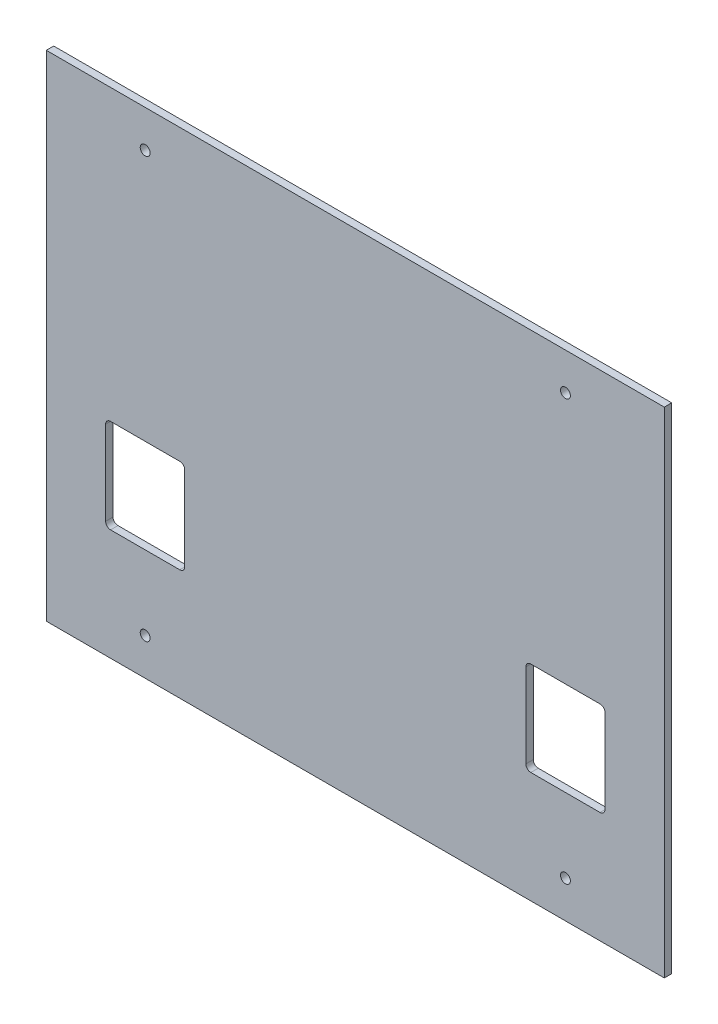
ISO-10303-21;
HEADER;
FILE_DESCRIPTION(('STEP AP214'),'2;1');
FILE_NAME('part.step','',(''),(''),'','','');
FILE_SCHEMA(('AUTOMOTIVE_DESIGN { 1 0 10303 214 1 1 1 1 }'));
ENDSEC;
DATA;
#1=APPLICATION_CONTEXT('core data for automotive mechanical design processes');
#2=APPLICATION_PROTOCOL_DEFINITION('international standard','automotive_design',2000,#1);
#3=PRODUCT_CONTEXT('',#1,'mechanical');
#4=PRODUCT('Part','Part','',(#3));
#5=PRODUCT_RELATED_PRODUCT_CATEGORY('part','',(#4));
#6=PRODUCT_DEFINITION_FORMATION('','',#4);
#7=PRODUCT_DEFINITION_CONTEXT('part definition',#1,'design');
#8=PRODUCT_DEFINITION('design','',#6,#7);
#9=PRODUCT_DEFINITION_SHAPE('','',#8);
#10=(LENGTH_UNIT() NAMED_UNIT(*) SI_UNIT(.MILLI.,.METRE.));
#11=(NAMED_UNIT(*) PLANE_ANGLE_UNIT() SI_UNIT($,.RADIAN.));
#12=(NAMED_UNIT(*) SI_UNIT($,.STERADIAN.) SOLID_ANGLE_UNIT());
#13=UNCERTAINTY_MEASURE_WITH_UNIT(LENGTH_MEASURE(1.E-05),#10,'distance_accuracy_value','');
#14=(GEOMETRIC_REPRESENTATION_CONTEXT(3) GLOBAL_UNCERTAINTY_ASSIGNED_CONTEXT((#13)) GLOBAL_UNIT_ASSIGNED_CONTEXT((#10,
#11,#12)) REPRESENTATION_CONTEXT('',''));
#15=CARTESIAN_POINT('',(0.,0.,0.));
#16=DIRECTION('',(0.,0.,1.));
#17=DIRECTION('',(1.,0.,0.));
#18=AXIS2_PLACEMENT_3D('',#15,#16,#17);
#19=CARTESIAN_POINT('',(-125.,-100.,3.));
#20=DIRECTION('',(1.,0.,0.));
#21=DIRECTION('',(0.,1.,0.));
#22=AXIS2_PLACEMENT_3D('',#19,#20,#21);
#23=PLANE('',#22);
#24=DIRECTION('',(0.,-1.,0.));
#25=VECTOR('',#24,1.);
#26=CARTESIAN_POINT('',(-125.,-100.,0.));
#27=LINE('',#26,#25);
#28=CARTESIAN_POINT('',(-125.,100.,0.));
#29=VERTEX_POINT('',#28);
#30=CARTESIAN_POINT('',(-125.,-100.,0.));
#31=VERTEX_POINT('',#30);
#32=EDGE_CURVE('E314',#29,#31,#27,.T.);
#33=ORIENTED_EDGE('',*,*,#32,.T.);
#34=DIRECTION('',(0.,0.,-1.));
#35=VECTOR('',#34,1.);
#36=CARTESIAN_POINT('',(-125.,-100.,3.));
#37=LINE('',#36,#35);
#38=CARTESIAN_POINT('',(-125.,-100.,3.));
#39=VERTEX_POINT('',#38);
#40=EDGE_CURVE('E11',#39,#31,#37,.T.);
#41=ORIENTED_EDGE('',*,*,#40,.F.);
#42=DIRECTION('',(0.,-1.,0.));
#43=VECTOR('',#42,1.);
#44=CARTESIAN_POINT('',(-125.,-100.,3.));
#45=LINE('',#44,#43);
#46=CARTESIAN_POINT('',(-125.,100.,3.));
#47=VERTEX_POINT('',#46);
#48=EDGE_CURVE('E317',#47,#39,#45,.T.);
#49=ORIENTED_EDGE('',*,*,#48,.F.);
#50=DIRECTION('',(0.,0.,-1.));
#51=VECTOR('',#50,1.);
#52=CARTESIAN_POINT('',(-125.,100.,3.));
#53=LINE('',#52,#51);
#54=EDGE_CURVE('E327',#47,#29,#53,.T.);
#55=ORIENTED_EDGE('',*,*,#54,.T.);
#56=EDGE_LOOP('',(#33,#41,#49,#55));
#57=FACE_BOUND('',#56,.T.);
#58=ADVANCED_FACE('F35',(#57),#23,.F.);
#59=CARTESIAN_POINT('',(125.,-100.,3.));
#60=DIRECTION('',(0.,1.,0.));
#61=DIRECTION('',(-1.,0.,0.));
#62=AXIS2_PLACEMENT_3D('',#59,#60,#61);
#63=PLANE('',#62);
#64=DIRECTION('',(1.,0.,0.));
#65=VECTOR('',#64,1.);
#66=CARTESIAN_POINT('',(125.,-100.,0.));
#67=LINE('',#66,#65);
#68=CARTESIAN_POINT('',(125.,-100.,0.));
#69=VERTEX_POINT('',#68);
#70=EDGE_CURVE('E330',#31,#69,#67,.T.);
#71=ORIENTED_EDGE('',*,*,#70,.T.);
#72=DIRECTION('',(0.,0.,-1.));
#73=VECTOR('',#72,1.);
#74=CARTESIAN_POINT('',(125.,-100.,3.));
#75=LINE('',#74,#73);
#76=CARTESIAN_POINT('',(125.,-100.,3.));
#77=VERTEX_POINT('',#76);
#78=EDGE_CURVE('E42',#77,#69,#75,.T.);
#79=ORIENTED_EDGE('',*,*,#78,.F.);
#80=DIRECTION('',(1.,0.,0.));
#81=VECTOR('',#80,1.);
#82=CARTESIAN_POINT('',(125.,-100.,3.));
#83=LINE('',#82,#81);
#84=EDGE_CURVE('E320',#39,#77,#83,.T.);
#85=ORIENTED_EDGE('',*,*,#84,.F.);
#86=ORIENTED_EDGE('',*,*,#40,.T.);
#87=EDGE_LOOP('',(#71,#79,#85,#86));
#88=FACE_BOUND('',#87,.T.);
#89=ADVANCED_FACE('F359',(#88),#63,.F.);
#90=CARTESIAN_POINT('',(125.,-100.,3.));
#91=DIRECTION('',(-1.,0.,0.));
#92=DIRECTION('',(0.,0.,1.));
#93=AXIS2_PLACEMENT_3D('',#90,#91,#92);
#94=PLANE('',#93);
#95=DIRECTION('',(0.,1.,0.));
#96=VECTOR('',#95,1.);
#97=CARTESIAN_POINT('',(125.,-100.,0.));
#98=LINE('',#97,#96);
#99=CARTESIAN_POINT('',(125.,100.,0.));
#100=VERTEX_POINT('',#99);
#101=EDGE_CURVE('E332',#69,#100,#98,.T.);
#102=ORIENTED_EDGE('',*,*,#101,.T.);
#103=DIRECTION('',(0.,0.,-1.));
#104=VECTOR('',#103,1.);
#105=CARTESIAN_POINT('',(125.,100.,3.));
#106=LINE('',#105,#104);
#107=CARTESIAN_POINT('',(125.,100.,3.));
#108=VERTEX_POINT('',#107);
#109=EDGE_CURVE('E337',#108,#100,#106,.T.);
#110=ORIENTED_EDGE('',*,*,#109,.F.);
#111=DIRECTION('',(0.,1.,0.));
#112=VECTOR('',#111,1.);
#113=CARTESIAN_POINT('',(125.,-100.,3.));
#114=LINE('',#113,#112);
#115=EDGE_CURVE('E323',#77,#108,#114,.T.);
#116=ORIENTED_EDGE('',*,*,#115,.F.);
#117=ORIENTED_EDGE('',*,*,#78,.T.);
#118=EDGE_LOOP('',(#102,#110,#116,#117));
#119=FACE_BOUND('',#118,.T.);
#120=ADVANCED_FACE('F344',(#119),#94,.F.);
#121=CARTESIAN_POINT('',(125.,100.,3.));
#122=DIRECTION('',(0.,-1.,0.));
#123=DIRECTION('',(0.,0.,-1.));
#124=AXIS2_PLACEMENT_3D('',#121,#122,#123);
#125=PLANE('',#124);
#126=DIRECTION('',(-1.,0.,0.));
#127=VECTOR('',#126,1.);
#128=CARTESIAN_POINT('',(125.,100.,0.));
#129=LINE('',#128,#127);
#130=EDGE_CURVE('E321',#100,#29,#129,.T.);
#131=ORIENTED_EDGE('',*,*,#130,.T.);
#132=ORIENTED_EDGE('',*,*,#54,.F.);
#133=DIRECTION('',(-1.,0.,0.));
#134=VECTOR('',#133,1.);
#135=CARTESIAN_POINT('',(125.,100.,3.));
#136=LINE('',#135,#134);
#137=EDGE_CURVE('E325',#108,#47,#136,.T.);
#138=ORIENTED_EDGE('',*,*,#137,.F.);
#139=ORIENTED_EDGE('',*,*,#109,.T.);
#140=EDGE_LOOP('',(#131,#132,#138,#139));
#141=FACE_BOUND('',#140,.T.);
#142=ADVANCED_FACE('F352',(#141),#125,.F.);
#143=CARTESIAN_POINT('',(0.,0.,3.));
#144=DIRECTION('',(0.,0.,1.));
#145=DIRECTION('',(1.,0.,0.));
#146=AXIS2_PLACEMENT_3D('',#143,#144,#145);
#147=PLANE('',#146);
#148=CARTESIAN_POINT('',(98.9999999999928,-53.0000000000045,3.));
#149=DIRECTION('',(0.,0.,1.));
#150=DIRECTION('',(1.,0.,0.));
#151=AXIS2_PLACEMENT_3D('',#148,#149,#150);
#152=CIRCLE('',#151,2.);
#153=CARTESIAN_POINT('',(98.9999999999928,-55.0000000000045,3.));
#154=VERTEX_POINT('',#153);
#155=CARTESIAN_POINT('',(100.999999999993,-53.0000000000045,3.));
#156=VERTEX_POINT('',#155);
#157=EDGE_CURVE('E290',#154,#156,#152,.T.);
#158=ORIENTED_EDGE('',*,*,#157,.F.);
#159=DIRECTION('',(1.,0.,0.));
#160=VECTOR('',#159,1.);
#161=CARTESIAN_POINT('',(0.,-55.0000000000045,3.));
#162=LINE('',#161,#160);
#163=CARTESIAN_POINT('',(70.9999999999929,-55.0000000000045,3.));
#164=VERTEX_POINT('',#163);
#165=EDGE_CURVE('E277',#164,#154,#162,.T.);
#166=ORIENTED_EDGE('',*,*,#165,.F.);
#167=CARTESIAN_POINT('',(70.9999999999929,-53.0000000000045,3.));
#168=DIRECTION('',(0.,0.,1.));
#169=DIRECTION('',(1.,0.,0.));
#170=AXIS2_PLACEMENT_3D('',#167,#168,#169);
#171=CIRCLE('',#170,2.);
#172=CARTESIAN_POINT('',(68.9999999999929,-53.0000000000045,3.));
#173=VERTEX_POINT('',#172);
#174=EDGE_CURVE('E176',#173,#164,#171,.T.);
#175=ORIENTED_EDGE('',*,*,#174,.F.);
#176=DIRECTION('',(0.,-1.,0.));
#177=VECTOR('',#176,1.);
#178=CARTESIAN_POINT('',(68.9999999999929,0.,3.));
#179=LINE('',#178,#177);
#180=CARTESIAN_POINT('',(68.9999999999929,-19.0000000000046,3.));
#181=VERTEX_POINT('',#180);
#182=EDGE_CURVE('E280',#181,#173,#179,.T.);
#183=ORIENTED_EDGE('',*,*,#182,.F.);
#184=CARTESIAN_POINT('',(70.9999999999929,-19.0000000000046,3.));
#185=DIRECTION('',(0.,0.,1.));
#186=DIRECTION('',(1.,0.,0.));
#187=AXIS2_PLACEMENT_3D('',#184,#185,#186);
#188=CIRCLE('',#187,2.);
#189=CARTESIAN_POINT('',(70.9999999999929,-17.0000000000046,3.));
#190=VERTEX_POINT('',#189);
#191=EDGE_CURVE('E282',#190,#181,#188,.T.);
#192=ORIENTED_EDGE('',*,*,#191,.F.);
#193=DIRECTION('',(-1.,0.,0.));
#194=VECTOR('',#193,1.);
#195=CARTESIAN_POINT('',(0.,-17.0000000000046,3.));
#196=LINE('',#195,#194);
#197=CARTESIAN_POINT('',(98.9999999999928,-17.0000000000046,3.));
#198=VERTEX_POINT('',#197);
#199=EDGE_CURVE('E284',#198,#190,#196,.T.);
#200=ORIENTED_EDGE('',*,*,#199,.F.);
#201=CARTESIAN_POINT('',(98.9999999999928,-19.0000000000046,3.));
#202=DIRECTION('',(0.,0.,1.));
#203=DIRECTION('',(1.,0.,0.));
#204=AXIS2_PLACEMENT_3D('',#201,#202,#203);
#205=CIRCLE('',#204,2.);
#206=CARTESIAN_POINT('',(100.999999999993,-19.0000000000046,3.));
#207=VERTEX_POINT('',#206);
#208=EDGE_CURVE('E286',#207,#198,#205,.T.);
#209=ORIENTED_EDGE('',*,*,#208,.F.);
#210=DIRECTION('',(0.,1.,0.));
#211=VECTOR('',#210,1.);
#212=CARTESIAN_POINT('',(100.999999999993,0.,3.));
#213=LINE('',#212,#211);
#214=EDGE_CURVE('E288',#156,#207,#213,.T.);
#215=ORIENTED_EDGE('',*,*,#214,.F.);
#216=EDGE_LOOP('',(#158,#166,#175,#183,#192,#200,#209,#215));
#217=FACE_BOUND('',#216,.T.);
#218=CARTESIAN_POINT('',(-98.9999999999928,-19.0000000000046,3.));
#219=DIRECTION('',(0.,0.,1.));
#220=DIRECTION('',(1.,0.,0.));
#221=AXIS2_PLACEMENT_3D('',#218,#219,#220);
#222=CIRCLE('',#221,2.);
#223=CARTESIAN_POINT('',(-98.9999999999928,-17.0000000000046,3.));
#224=VERTEX_POINT('',#223);
#225=CARTESIAN_POINT('',(-100.999999999993,-19.0000000000046,3.));
#226=VERTEX_POINT('',#225);
#227=EDGE_CURVE('E275',#224,#226,#222,.T.);
#228=ORIENTED_EDGE('',*,*,#227,.F.);
#229=DIRECTION('',(-1.,0.,0.));
#230=VECTOR('',#229,1.);
#231=CARTESIAN_POINT('',(0.,-17.0000000000046,3.));
#232=LINE('',#231,#230);
#233=CARTESIAN_POINT('',(-70.9999999999929,-17.0000000000046,3.));
#234=VERTEX_POINT('',#233);
#235=EDGE_CURVE('E213',#234,#224,#232,.T.);
#236=ORIENTED_EDGE('',*,*,#235,.F.);
#237=CARTESIAN_POINT('',(-70.9999999999929,-19.0000000000046,3.));
#238=DIRECTION('',(0.,0.,1.));
#239=DIRECTION('',(1.,0.,0.));
#240=AXIS2_PLACEMENT_3D('',#237,#238,#239);
#241=CIRCLE('',#240,2.);
#242=CARTESIAN_POINT('',(-68.9999999999929,-19.0000000000046,3.));
#243=VERTEX_POINT('',#242);
#244=EDGE_CURVE('E263',#243,#234,#241,.T.);
#245=ORIENTED_EDGE('',*,*,#244,.F.);
#246=DIRECTION('',(0.,1.,0.));
#247=VECTOR('',#246,1.);
#248=CARTESIAN_POINT('',(-68.9999999999929,0.,3.));
#249=LINE('',#248,#247);
#250=CARTESIAN_POINT('',(-68.9999999999929,-53.0000000000045,3.));
#251=VERTEX_POINT('',#250);
#252=EDGE_CURVE('E265',#251,#243,#249,.T.);
#253=ORIENTED_EDGE('',*,*,#252,.F.);
#254=CARTESIAN_POINT('',(-70.9999999999929,-53.0000000000045,3.));
#255=DIRECTION('',(0.,0.,1.));
#256=DIRECTION('',(1.,0.,0.));
#257=AXIS2_PLACEMENT_3D('',#254,#255,#256);
#258=CIRCLE('',#257,2.);
#259=CARTESIAN_POINT('',(-70.9999999999929,-55.0000000000045,3.));
#260=VERTEX_POINT('',#259);
#261=EDGE_CURVE('E267',#260,#251,#258,.T.);
#262=ORIENTED_EDGE('',*,*,#261,.F.);
#263=DIRECTION('',(1.,0.,0.));
#264=VECTOR('',#263,1.);
#265=CARTESIAN_POINT('',(0.,-55.0000000000045,3.));
#266=LINE('',#265,#264);
#267=CARTESIAN_POINT('',(-98.9999999999928,-55.0000000000045,3.));
#268=VERTEX_POINT('',#267);
#269=EDGE_CURVE('E269',#268,#260,#266,.T.);
#270=ORIENTED_EDGE('',*,*,#269,.F.);
#271=CARTESIAN_POINT('',(-98.9999999999928,-53.0000000000045,3.));
#272=DIRECTION('',(0.,0.,1.));
#273=DIRECTION('',(1.,0.,0.));
#274=AXIS2_PLACEMENT_3D('',#271,#272,#273);
#275=CIRCLE('',#274,2.);
#276=CARTESIAN_POINT('',(-100.999999999993,-53.0000000000045,3.));
#277=VERTEX_POINT('',#276);
#278=EDGE_CURVE('E271',#277,#268,#275,.T.);
#279=ORIENTED_EDGE('',*,*,#278,.F.);
#280=DIRECTION('',(0.,-1.,0.));
#281=VECTOR('',#280,1.);
#282=CARTESIAN_POINT('',(-100.999999999993,0.,3.));
#283=LINE('',#282,#281);
#284=EDGE_CURVE('E273',#226,#277,#283,.T.);
#285=ORIENTED_EDGE('',*,*,#284,.F.);
#286=EDGE_LOOP('',(#228,#236,#245,#253,#262,#270,#279,#285));
#287=FACE_BOUND('',#286,.T.);
#288=CARTESIAN_POINT('',(85.,85.,3.));
#289=DIRECTION('',(0.,0.,1.));
#290=DIRECTION('',(-1.,0.,0.));
#291=AXIS2_PLACEMENT_3D('',#288,#289,#290);
#292=CIRCLE('',#291,2.);
#293=CARTESIAN_POINT('',(83.,85.,3.));
#294=VERTEX_POINT('',#293);
#295=EDGE_CURVE('E292',#294,#294,#292,.T.);
#296=ORIENTED_EDGE('',*,*,#295,.F.);
#297=EDGE_LOOP('',(#296));
#298=FACE_BOUND('',#297,.T.);
#299=CARTESIAN_POINT('',(85.,-85.,3.));
#300=DIRECTION('',(0.,0.,1.));
#301=DIRECTION('',(-1.,0.,0.));
#302=AXIS2_PLACEMENT_3D('',#299,#300,#301);
#303=CIRCLE('',#302,2.);
#304=CARTESIAN_POINT('',(83.,-85.,3.));
#305=VERTEX_POINT('',#304);
#306=EDGE_CURVE('E303',#305,#305,#303,.T.);
#307=ORIENTED_EDGE('',*,*,#306,.F.);
#308=EDGE_LOOP('',(#307));
#309=FACE_BOUND('',#308,.T.);
#310=CARTESIAN_POINT('',(-85.,-85.,3.));
#311=DIRECTION('',(0.,0.,1.));
#312=DIRECTION('',(1.,0.,0.));
#313=AXIS2_PLACEMENT_3D('',#310,#311,#312);
#314=CIRCLE('',#313,2.);
#315=CARTESIAN_POINT('',(-83.,-85.,3.));
#316=VERTEX_POINT('',#315);
#317=EDGE_CURVE('E297',#316,#316,#314,.T.);
#318=ORIENTED_EDGE('',*,*,#317,.F.);
#319=EDGE_LOOP('',(#318));
#320=FACE_BOUND('',#319,.T.);
#321=CARTESIAN_POINT('',(-85.,85.,3.));
#322=DIRECTION('',(0.,0.,1.));
#323=DIRECTION('',(1.,0.,0.));
#324=AXIS2_PLACEMENT_3D('',#321,#322,#323);
#325=CIRCLE('',#324,2.);
#326=CARTESIAN_POINT('',(-83.,85.,3.));
#327=VERTEX_POINT('',#326);
#328=EDGE_CURVE('E296',#327,#327,#325,.T.);
#329=ORIENTED_EDGE('',*,*,#328,.F.);
#330=EDGE_LOOP('',(#329));
#331=FACE_BOUND('',#330,.T.);
#332=ORIENTED_EDGE('',*,*,#48,.T.);
#333=ORIENTED_EDGE('',*,*,#84,.T.);
#334=ORIENTED_EDGE('',*,*,#115,.T.);
#335=ORIENTED_EDGE('',*,*,#137,.T.);
#336=EDGE_LOOP('',(#332,#333,#334,#335));
#337=FACE_BOUND('',#336,.T.);
#338=ADVANCED_FACE('F358',(#217,#287,#298,#309,#320,#331,#337),#147,.T.);
#339=CARTESIAN_POINT('',(0.,0.,0.));
#340=DIRECTION('',(0.,0.,1.));
#341=DIRECTION('',(1.,0.,0.));
#342=AXIS2_PLACEMENT_3D('',#339,#340,#341);
#343=PLANE('',#342);
#344=DIRECTION('',(-1.,0.,0.));
#345=VECTOR('',#344,1.);
#346=CARTESIAN_POINT('',(98.9999999999928,-55.0000000000045,0.));
#347=LINE('',#346,#345);
#348=CARTESIAN_POINT('',(98.9999999999928,-55.0000000000045,0.));
#349=VERTEX_POINT('',#348);
#350=CARTESIAN_POINT('',(70.9999999999929,-55.0000000000045,0.));
#351=VERTEX_POINT('',#350);
#352=EDGE_CURVE('E183',#349,#351,#347,.T.);
#353=ORIENTED_EDGE('',*,*,#352,.F.);
#354=CARTESIAN_POINT('',(98.9999999999928,-53.0000000000045,0.));
#355=DIRECTION('',(0.,0.,-1.));
#356=DIRECTION('',(1.,0.,0.));
#357=AXIS2_PLACEMENT_3D('',#354,#355,#356);
#358=CIRCLE('',#357,2.);
#359=CARTESIAN_POINT('',(100.999999999993,-53.0000000000045,0.));
#360=VERTEX_POINT('',#359);
#361=EDGE_CURVE('E188',#360,#349,#358,.T.);
#362=ORIENTED_EDGE('',*,*,#361,.F.);
#363=DIRECTION('',(0.,-1.,0.));
#364=VECTOR('',#363,1.);
#365=CARTESIAN_POINT('',(100.999999999993,-19.0000000000046,0.));
#366=LINE('',#365,#364);
#367=CARTESIAN_POINT('',(100.999999999993,-19.0000000000046,0.));
#368=VERTEX_POINT('',#367);
#369=EDGE_CURVE('E208',#368,#360,#366,.T.);
#370=ORIENTED_EDGE('',*,*,#369,.F.);
#371=CARTESIAN_POINT('',(98.9999999999928,-19.0000000000046,0.));
#372=DIRECTION('',(0.,0.,-1.));
#373=DIRECTION('',(-1.,0.,0.));
#374=AXIS2_PLACEMENT_3D('',#371,#372,#373);
#375=CIRCLE('',#374,2.);
#376=CARTESIAN_POINT('',(98.9999999999928,-17.0000000000046,0.));
#377=VERTEX_POINT('',#376);
#378=EDGE_CURVE('E205',#377,#368,#375,.T.);
#379=ORIENTED_EDGE('',*,*,#378,.F.);
#380=DIRECTION('',(1.,0.,0.));
#381=VECTOR('',#380,1.);
#382=CARTESIAN_POINT('',(98.9999999999928,-17.0000000000046,0.));
#383=LINE('',#382,#381);
#384=CARTESIAN_POINT('',(70.9999999999929,-17.0000000000046,0.));
#385=VERTEX_POINT('',#384);
#386=EDGE_CURVE('E202',#385,#377,#383,.T.);
#387=ORIENTED_EDGE('',*,*,#386,.F.);
#388=CARTESIAN_POINT('',(70.9999999999929,-19.0000000000046,0.));
#389=DIRECTION('',(0.,0.,-1.));
#390=DIRECTION('',(-1.,0.,0.));
#391=AXIS2_PLACEMENT_3D('',#388,#389,#390);
#392=CIRCLE('',#391,2.);
#393=CARTESIAN_POINT('',(68.9999999999929,-19.0000000000046,0.));
#394=VERTEX_POINT('',#393);
#395=EDGE_CURVE('E196',#394,#385,#392,.T.);
#396=ORIENTED_EDGE('',*,*,#395,.F.);
#397=DIRECTION('',(0.,1.,0.));
#398=VECTOR('',#397,1.);
#399=CARTESIAN_POINT('',(68.9999999999929,-19.0000000000046,0.));
#400=LINE('',#399,#398);
#401=CARTESIAN_POINT('',(68.9999999999929,-53.0000000000045,0.));
#402=VERTEX_POINT('',#401);
#403=EDGE_CURVE('E194',#402,#394,#400,.T.);
#404=ORIENTED_EDGE('',*,*,#403,.F.);
#405=CARTESIAN_POINT('',(70.9999999999929,-53.0000000000045,0.));
#406=DIRECTION('',(0.,0.,-1.));
#407=DIRECTION('',(-1.,0.,0.));
#408=AXIS2_PLACEMENT_3D('',#405,#406,#407);
#409=CIRCLE('',#408,2.);
#410=EDGE_CURVE('E173',#351,#402,#409,.T.);
#411=ORIENTED_EDGE('',*,*,#410,.F.);
#412=EDGE_LOOP('',(#353,#362,#370,#379,#387,#396,#404,#411));
#413=FACE_BOUND('',#412,.T.);
#414=DIRECTION('',(1.,0.,0.));
#415=VECTOR('',#414,1.);
#416=CARTESIAN_POINT('',(-98.9999999999928,-17.0000000000046,0.));
#417=LINE('',#416,#415);
#418=CARTESIAN_POINT('',(-98.9999999999928,-17.0000000000046,0.));
#419=VERTEX_POINT('',#418);
#420=CARTESIAN_POINT('',(-70.9999999999929,-17.0000000000046,0.));
#421=VERTEX_POINT('',#420);
#422=EDGE_CURVE('E226',#419,#421,#417,.T.);
#423=ORIENTED_EDGE('',*,*,#422,.F.);
#424=CARTESIAN_POINT('',(-98.9999999999928,-19.0000000000046,0.));
#425=DIRECTION('',(0.,0.,-1.));
#426=DIRECTION('',(1.,0.,0.));
#427=AXIS2_PLACEMENT_3D('',#424,#425,#426);
#428=CIRCLE('',#427,2.);
#429=CARTESIAN_POINT('',(-100.999999999993,-19.0000000000046,0.));
#430=VERTEX_POINT('',#429);
#431=EDGE_CURVE('E224',#430,#419,#428,.T.);
#432=ORIENTED_EDGE('',*,*,#431,.F.);
#433=DIRECTION('',(0.,1.,0.));
#434=VECTOR('',#433,1.);
#435=CARTESIAN_POINT('',(-100.999999999993,-19.0000000000046,0.));
#436=LINE('',#435,#434);
#437=CARTESIAN_POINT('',(-100.999999999993,-53.0000000000045,0.));
#438=VERTEX_POINT('',#437);
#439=EDGE_CURVE('E243',#438,#430,#436,.T.);
#440=ORIENTED_EDGE('',*,*,#439,.F.);
#441=CARTESIAN_POINT('',(-98.9999999999928,-53.0000000000045,0.));
#442=DIRECTION('',(0.,0.,-1.));
#443=DIRECTION('',(-1.,0.,0.));
#444=AXIS2_PLACEMENT_3D('',#441,#442,#443);
#445=CIRCLE('',#444,2.);
#446=CARTESIAN_POINT('',(-98.9999999999928,-55.0000000000045,0.));
#447=VERTEX_POINT('',#446);
#448=EDGE_CURVE('E240',#447,#438,#445,.T.);
#449=ORIENTED_EDGE('',*,*,#448,.F.);
#450=DIRECTION('',(-1.,0.,0.));
#451=VECTOR('',#450,1.);
#452=CARTESIAN_POINT('',(-98.9999999999928,-55.0000000000045,0.));
#453=LINE('',#452,#451);
#454=CARTESIAN_POINT('',(-70.9999999999929,-55.0000000000045,0.));
#455=VERTEX_POINT('',#454);
#456=EDGE_CURVE('E237',#455,#447,#453,.T.);
#457=ORIENTED_EDGE('',*,*,#456,.F.);
#458=CARTESIAN_POINT('',(-70.9999999999929,-53.0000000000045,0.));
#459=DIRECTION('',(0.,0.,-1.));
#460=DIRECTION('',(1.,0.,0.));
#461=AXIS2_PLACEMENT_3D('',#458,#459,#460);
#462=CIRCLE('',#461,2.);
#463=CARTESIAN_POINT('',(-68.9999999999929,-53.0000000000045,0.));
#464=VERTEX_POINT('',#463);
#465=EDGE_CURVE('E234',#464,#455,#462,.T.);
#466=ORIENTED_EDGE('',*,*,#465,.F.);
#467=DIRECTION('',(0.,-1.,0.));
#468=VECTOR('',#467,1.);
#469=CARTESIAN_POINT('',(-68.9999999999929,-19.0000000000046,0.));
#470=LINE('',#469,#468);
#471=CARTESIAN_POINT('',(-68.9999999999929,-19.0000000000046,0.));
#472=VERTEX_POINT('',#471);
#473=EDGE_CURVE('E231',#472,#464,#470,.T.);
#474=ORIENTED_EDGE('',*,*,#473,.F.);
#475=CARTESIAN_POINT('',(-70.9999999999929,-19.0000000000046,0.));
#476=DIRECTION('',(0.,0.,-1.));
#477=DIRECTION('',(1.,0.,0.));
#478=AXIS2_PLACEMENT_3D('',#475,#476,#477);
#479=CIRCLE('',#478,2.);
#480=EDGE_CURVE('E228',#421,#472,#479,.T.);
#481=ORIENTED_EDGE('',*,*,#480,.F.);
#482=EDGE_LOOP('',(#423,#432,#440,#449,#457,#466,#474,#481));
#483=FACE_BOUND('',#482,.T.);
#484=CARTESIAN_POINT('',(85.,85.,0.));
#485=DIRECTION('',(0.,0.,1.));
#486=DIRECTION('',(-1.,0.,0.));
#487=AXIS2_PLACEMENT_3D('',#484,#485,#486);
#488=CIRCLE('',#487,2.);
#489=CARTESIAN_POINT('',(83.,85.,0.));
#490=VERTEX_POINT('',#489);
#491=EDGE_CURVE('E306',#490,#490,#488,.T.);
#492=ORIENTED_EDGE('',*,*,#491,.T.);
#493=EDGE_LOOP('',(#492));
#494=FACE_BOUND('',#493,.T.);
#495=CARTESIAN_POINT('',(85.,-85.,0.));
#496=DIRECTION('',(0.,0.,1.));
#497=DIRECTION('',(-1.,0.,0.));
#498=AXIS2_PLACEMENT_3D('',#495,#496,#497);
#499=CIRCLE('',#498,2.);
#500=CARTESIAN_POINT('',(83.,-85.,0.));
#501=VERTEX_POINT('',#500);
#502=EDGE_CURVE('E300',#501,#501,#499,.T.);
#503=ORIENTED_EDGE('',*,*,#502,.T.);
#504=EDGE_LOOP('',(#503));
#505=FACE_BOUND('',#504,.T.);
#506=CARTESIAN_POINT('',(-85.,-85.,0.));
#507=DIRECTION('',(0.,0.,1.));
#508=DIRECTION('',(1.,0.,0.));
#509=AXIS2_PLACEMENT_3D('',#506,#507,#508);
#510=CIRCLE('',#509,2.);
#511=CARTESIAN_POINT('',(-83.,-85.,0.));
#512=VERTEX_POINT('',#511);
#513=EDGE_CURVE('E293',#512,#512,#510,.T.);
#514=ORIENTED_EDGE('',*,*,#513,.T.);
#515=EDGE_LOOP('',(#514));
#516=FACE_BOUND('',#515,.T.);
#517=CARTESIAN_POINT('',(-85.,85.,0.));
#518=DIRECTION('',(0.,0.,1.));
#519=DIRECTION('',(1.,0.,0.));
#520=AXIS2_PLACEMENT_3D('',#517,#518,#519);
#521=CIRCLE('',#520,2.);
#522=CARTESIAN_POINT('',(-83.,85.,0.));
#523=VERTEX_POINT('',#522);
#524=EDGE_CURVE('E311',#523,#523,#521,.T.);
#525=ORIENTED_EDGE('',*,*,#524,.T.);
#526=EDGE_LOOP('',(#525));
#527=FACE_BOUND('',#526,.T.);
#528=ORIENTED_EDGE('',*,*,#32,.F.);
#529=ORIENTED_EDGE('',*,*,#130,.F.);
#530=ORIENTED_EDGE('',*,*,#101,.F.);
#531=ORIENTED_EDGE('',*,*,#70,.F.);
#532=EDGE_LOOP('',(#528,#529,#530,#531));
#533=FACE_BOUND('',#532,.T.);
#534=ADVANCED_FACE('F190',(#413,#483,#494,#505,#516,#527,#533),#343,.F.);
#535=CARTESIAN_POINT('',(-85.,85.,0.));
#536=DIRECTION('',(0.,0.,1.));
#537=DIRECTION('',(1.,0.,0.));
#538=AXIS2_PLACEMENT_3D('',#535,#536,#537);
#539=CYLINDRICAL_SURFACE('',#538,2.);
#540=ORIENTED_EDGE('',*,*,#524,.F.);
#541=EDGE_LOOP('',(#540));
#542=FACE_BOUND('',#541,.T.);
#543=ORIENTED_EDGE('',*,*,#328,.T.);
#544=EDGE_LOOP('',(#543));
#545=FACE_BOUND('',#544,.T.);
#546=ADVANCED_FACE('F371',(#542,#545),#539,.F.);
#547=CARTESIAN_POINT('',(-85.,-85.,0.));
#548=DIRECTION('',(0.,0.,1.));
#549=DIRECTION('',(1.,0.,0.));
#550=AXIS2_PLACEMENT_3D('',#547,#548,#549);
#551=CYLINDRICAL_SURFACE('',#550,2.);
#552=ORIENTED_EDGE('',*,*,#513,.F.);
#553=EDGE_LOOP('',(#552));
#554=FACE_BOUND('',#553,.T.);
#555=ORIENTED_EDGE('',*,*,#317,.T.);
#556=EDGE_LOOP('',(#555));
#557=FACE_BOUND('',#556,.T.);
#558=ADVANCED_FACE('F377',(#554,#557),#551,.F.);
#559=CARTESIAN_POINT('',(85.,-85.,0.));
#560=DIRECTION('',(0.,0.,1.));
#561=DIRECTION('',(1.,0.,0.));
#562=AXIS2_PLACEMENT_3D('',#559,#560,#561);
#563=CYLINDRICAL_SURFACE('',#562,2.);
#564=ORIENTED_EDGE('',*,*,#502,.F.);
#565=EDGE_LOOP('',(#564));
#566=FACE_BOUND('',#565,.T.);
#567=ORIENTED_EDGE('',*,*,#306,.T.);
#568=EDGE_LOOP('',(#567));
#569=FACE_BOUND('',#568,.T.);
#570=ADVANCED_FACE('F383',(#566,#569),#563,.F.);
#571=CARTESIAN_POINT('',(85.,85.,0.));
#572=DIRECTION('',(0.,0.,1.));
#573=DIRECTION('',(1.,0.,0.));
#574=AXIS2_PLACEMENT_3D('',#571,#572,#573);
#575=CYLINDRICAL_SURFACE('',#574,2.);
#576=ORIENTED_EDGE('',*,*,#491,.F.);
#577=EDGE_LOOP('',(#576));
#578=FACE_BOUND('',#577,.T.);
#579=ORIENTED_EDGE('',*,*,#295,.T.);
#580=EDGE_LOOP('',(#579));
#581=FACE_BOUND('',#580,.T.);
#582=ADVANCED_FACE('F379',(#578,#581),#575,.F.);
#583=CARTESIAN_POINT('',(-98.9999999999928,-19.0000000000046,10.));
#584=DIRECTION('',(0.,0.,-1.));
#585=DIRECTION('',(-1.,0.,0.));
#586=AXIS2_PLACEMENT_3D('',#583,#584,#585);
#587=CYLINDRICAL_SURFACE('',#586,2.);
#588=ORIENTED_EDGE('',*,*,#227,.T.);
#589=DIRECTION('',(0.,0.,-1.));
#590=VECTOR('',#589,1.);
#591=CARTESIAN_POINT('',(-100.999999999993,-19.0000000000046,10.));
#592=LINE('',#591,#590);
#593=EDGE_CURVE('E247',#226,#430,#592,.T.);
#594=ORIENTED_EDGE('',*,*,#593,.T.);
#595=ORIENTED_EDGE('',*,*,#431,.T.);
#596=DIRECTION('',(0.,0.,-1.));
#597=VECTOR('',#596,1.);
#598=CARTESIAN_POINT('',(-98.9999999999928,-17.0000000000046,10.));
#599=LINE('',#598,#597);
#600=EDGE_CURVE('E246',#224,#419,#599,.T.);
#601=ORIENTED_EDGE('',*,*,#600,.F.);
#602=EDGE_LOOP('',(#588,#594,#595,#601));
#603=FACE_BOUND('',#602,.T.);
#604=ADVANCED_FACE('F382',(#603),#587,.F.);
#605=CARTESIAN_POINT('',(-100.999999999993,-19.0000000000046,10.));
#606=DIRECTION('',(-1.,0.,0.));
#607=DIRECTION('',(0.,0.,1.));
#608=AXIS2_PLACEMENT_3D('',#605,#606,#607);
#609=PLANE('',#608);
#610=ORIENTED_EDGE('',*,*,#284,.T.);
#611=DIRECTION('',(0.,0.,-1.));
#612=VECTOR('',#611,1.);
#613=CARTESIAN_POINT('',(-100.999999999993,-53.0000000000045,10.));
#614=LINE('',#613,#612);
#615=EDGE_CURVE('E249',#277,#438,#614,.T.);
#616=ORIENTED_EDGE('',*,*,#615,.T.);
#617=ORIENTED_EDGE('',*,*,#439,.T.);
#618=ORIENTED_EDGE('',*,*,#593,.F.);
#619=EDGE_LOOP('',(#610,#616,#617,#618));
#620=FACE_BOUND('',#619,.T.);
#621=ADVANCED_FACE('F393',(#620),#609,.F.);
#622=CARTESIAN_POINT('',(-98.9999999999928,-53.0000000000045,10.));
#623=DIRECTION('',(0.,0.,-1.));
#624=DIRECTION('',(-1.,0.,0.));
#625=AXIS2_PLACEMENT_3D('',#622,#623,#624);
#626=CYLINDRICAL_SURFACE('',#625,2.);
#627=ORIENTED_EDGE('',*,*,#278,.T.);
#628=DIRECTION('',(0.,0.,-1.));
#629=VECTOR('',#628,1.);
#630=CARTESIAN_POINT('',(-98.9999999999928,-55.0000000000045,10.));
#631=LINE('',#630,#629);
#632=EDGE_CURVE('E251',#268,#447,#631,.T.);
#633=ORIENTED_EDGE('',*,*,#632,.T.);
#634=ORIENTED_EDGE('',*,*,#448,.T.);
#635=ORIENTED_EDGE('',*,*,#615,.F.);
#636=EDGE_LOOP('',(#627,#633,#634,#635));
#637=FACE_BOUND('',#636,.T.);
#638=ADVANCED_FACE('F414',(#637),#626,.F.);
#639=CARTESIAN_POINT('',(-98.9999999999928,-55.0000000000045,10.));
#640=DIRECTION('',(0.,-1.,0.));
#641=DIRECTION('',(0.,0.,-1.));
#642=AXIS2_PLACEMENT_3D('',#639,#640,#641);
#643=PLANE('',#642);
#644=ORIENTED_EDGE('',*,*,#269,.T.);
#645=DIRECTION('',(0.,0.,-1.));
#646=VECTOR('',#645,1.);
#647=CARTESIAN_POINT('',(-70.9999999999929,-55.0000000000045,10.));
#648=LINE('',#647,#646);
#649=EDGE_CURVE('E253',#260,#455,#648,.T.);
#650=ORIENTED_EDGE('',*,*,#649,.T.);
#651=ORIENTED_EDGE('',*,*,#456,.T.);
#652=ORIENTED_EDGE('',*,*,#632,.F.);
#653=EDGE_LOOP('',(#644,#650,#651,#652));
#654=FACE_BOUND('',#653,.T.);
#655=ADVANCED_FACE('F410',(#654),#643,.F.);
#656=CARTESIAN_POINT('',(-70.9999999999929,-53.0000000000045,10.));
#657=DIRECTION('',(0.,0.,-1.));
#658=DIRECTION('',(-1.,0.,0.));
#659=AXIS2_PLACEMENT_3D('',#656,#657,#658);
#660=CYLINDRICAL_SURFACE('',#659,2.);
#661=ORIENTED_EDGE('',*,*,#261,.T.);
#662=DIRECTION('',(0.,0.,-1.));
#663=VECTOR('',#662,1.);
#664=CARTESIAN_POINT('',(-68.9999999999929,-53.0000000000045,10.));
#665=LINE('',#664,#663);
#666=EDGE_CURVE('E255',#251,#464,#665,.T.);
#667=ORIENTED_EDGE('',*,*,#666,.T.);
#668=ORIENTED_EDGE('',*,*,#465,.T.);
#669=ORIENTED_EDGE('',*,*,#649,.F.);
#670=EDGE_LOOP('',(#661,#667,#668,#669));
#671=FACE_BOUND('',#670,.T.);
#672=ADVANCED_FACE('F406',(#671),#660,.F.);
#673=CARTESIAN_POINT('',(-68.9999999999929,-19.0000000000046,10.));
#674=DIRECTION('',(1.,0.,0.));
#675=DIRECTION('',(0.,1.,0.));
#676=AXIS2_PLACEMENT_3D('',#673,#674,#675);
#677=PLANE('',#676);
#678=ORIENTED_EDGE('',*,*,#252,.T.);
#679=DIRECTION('',(0.,0.,-1.));
#680=VECTOR('',#679,1.);
#681=CARTESIAN_POINT('',(-68.9999999999929,-19.0000000000046,10.));
#682=LINE('',#681,#680);
#683=EDGE_CURVE('E257',#243,#472,#682,.T.);
#684=ORIENTED_EDGE('',*,*,#683,.T.);
#685=ORIENTED_EDGE('',*,*,#473,.T.);
#686=ORIENTED_EDGE('',*,*,#666,.F.);
#687=EDGE_LOOP('',(#678,#684,#685,#686));
#688=FACE_BOUND('',#687,.T.);
#689=ADVANCED_FACE('F402',(#688),#677,.F.);
#690=CARTESIAN_POINT('',(-70.9999999999929,-19.0000000000046,10.));
#691=DIRECTION('',(0.,0.,-1.));
#692=DIRECTION('',(-1.,0.,0.));
#693=AXIS2_PLACEMENT_3D('',#690,#691,#692);
#694=CYLINDRICAL_SURFACE('',#693,2.);
#695=ORIENTED_EDGE('',*,*,#244,.T.);
#696=DIRECTION('',(0.,0.,-1.));
#697=VECTOR('',#696,1.);
#698=CARTESIAN_POINT('',(-70.9999999999929,-17.0000000000046,10.));
#699=LINE('',#698,#697);
#700=EDGE_CURVE('E57',#234,#421,#699,.T.);
#701=ORIENTED_EDGE('',*,*,#700,.T.);
#702=ORIENTED_EDGE('',*,*,#480,.T.);
#703=ORIENTED_EDGE('',*,*,#683,.F.);
#704=EDGE_LOOP('',(#695,#701,#702,#703));
#705=FACE_BOUND('',#704,.T.);
#706=ADVANCED_FACE('F399',(#705),#694,.F.);
#707=CARTESIAN_POINT('',(-98.9999999999928,-17.0000000000046,10.));
#708=DIRECTION('',(0.,1.,0.));
#709=DIRECTION('',(0.,0.,1.));
#710=AXIS2_PLACEMENT_3D('',#707,#708,#709);
#711=PLANE('',#710);
#712=ORIENTED_EDGE('',*,*,#235,.T.);
#713=ORIENTED_EDGE('',*,*,#600,.T.);
#714=ORIENTED_EDGE('',*,*,#422,.T.);
#715=ORIENTED_EDGE('',*,*,#700,.F.);
#716=EDGE_LOOP('',(#712,#713,#714,#715));
#717=FACE_BOUND('',#716,.T.);
#718=ADVANCED_FACE('F395',(#717),#711,.F.);
#719=CARTESIAN_POINT('',(98.9999999999928,-53.0000000000045,10.));
#720=DIRECTION('',(0.,0.,-1.));
#721=DIRECTION('',(-1.,0.,0.));
#722=AXIS2_PLACEMENT_3D('',#719,#720,#721);
#723=CYLINDRICAL_SURFACE('',#722,2.);
#724=ORIENTED_EDGE('',*,*,#157,.T.);
#725=DIRECTION('',(0.,0.,-1.));
#726=VECTOR('',#725,1.);
#727=CARTESIAN_POINT('',(100.999999999993,-53.0000000000045,10.));
#728=LINE('',#727,#726);
#729=EDGE_CURVE('E211',#156,#360,#728,.T.);
#730=ORIENTED_EDGE('',*,*,#729,.T.);
#731=ORIENTED_EDGE('',*,*,#361,.T.);
#732=DIRECTION('',(0.,0.,-1.));
#733=VECTOR('',#732,1.);
#734=CARTESIAN_POINT('',(98.9999999999928,-55.0000000000045,10.));
#735=LINE('',#734,#733);
#736=EDGE_CURVE('E179',#154,#349,#735,.T.);
#737=ORIENTED_EDGE('',*,*,#736,.F.);
#738=EDGE_LOOP('',(#724,#730,#731,#737));
#739=FACE_BOUND('',#738,.T.);
#740=ADVANCED_FACE('F398',(#739),#723,.F.);
#741=CARTESIAN_POINT('',(100.999999999993,-19.0000000000046,10.));
#742=DIRECTION('',(1.,0.,0.));
#743=DIRECTION('',(0.,0.,-1.));
#744=AXIS2_PLACEMENT_3D('',#741,#742,#743);
#745=PLANE('',#744);
#746=ORIENTED_EDGE('',*,*,#214,.T.);
#747=DIRECTION('',(0.,0.,-1.));
#748=VECTOR('',#747,1.);
#749=CARTESIAN_POINT('',(100.999999999993,-19.0000000000046,10.));
#750=LINE('',#749,#748);
#751=EDGE_CURVE('E214',#207,#368,#750,.T.);
#752=ORIENTED_EDGE('',*,*,#751,.T.);
#753=ORIENTED_EDGE('',*,*,#369,.T.);
#754=ORIENTED_EDGE('',*,*,#729,.F.);
#755=EDGE_LOOP('',(#746,#752,#753,#754));
#756=FACE_BOUND('',#755,.T.);
#757=ADVANCED_FACE('F424',(#756),#745,.F.);
#758=CARTESIAN_POINT('',(98.9999999999928,-19.0000000000046,10.));
#759=DIRECTION('',(0.,0.,-1.));
#760=DIRECTION('',(-1.,0.,0.));
#761=AXIS2_PLACEMENT_3D('',#758,#759,#760);
#762=CYLINDRICAL_SURFACE('',#761,2.);
#763=ORIENTED_EDGE('',*,*,#208,.T.);
#764=DIRECTION('',(0.,0.,-1.));
#765=VECTOR('',#764,1.);
#766=CARTESIAN_POINT('',(98.9999999999928,-17.0000000000046,10.));
#767=LINE('',#766,#765);
#768=EDGE_CURVE('E216',#198,#377,#767,.T.);
#769=ORIENTED_EDGE('',*,*,#768,.T.);
#770=ORIENTED_EDGE('',*,*,#378,.T.);
#771=ORIENTED_EDGE('',*,*,#751,.F.);
#772=EDGE_LOOP('',(#763,#769,#770,#771));
#773=FACE_BOUND('',#772,.T.);
#774=ADVANCED_FACE('F441',(#773),#762,.F.);
#775=CARTESIAN_POINT('',(98.9999999999928,-17.0000000000046,10.));
#776=DIRECTION('',(0.,1.,0.));
#777=DIRECTION('',(0.,0.,1.));
#778=AXIS2_PLACEMENT_3D('',#775,#776,#777);
#779=PLANE('',#778);
#780=ORIENTED_EDGE('',*,*,#199,.T.);
#781=DIRECTION('',(0.,0.,-1.));
#782=VECTOR('',#781,1.);
#783=CARTESIAN_POINT('',(70.9999999999929,-17.0000000000046,10.));
#784=LINE('',#783,#782);
#785=EDGE_CURVE('E218',#190,#385,#784,.T.);
#786=ORIENTED_EDGE('',*,*,#785,.T.);
#787=ORIENTED_EDGE('',*,*,#386,.T.);
#788=ORIENTED_EDGE('',*,*,#768,.F.);
#789=EDGE_LOOP('',(#780,#786,#787,#788));
#790=FACE_BOUND('',#789,.T.);
#791=ADVANCED_FACE('F437',(#790),#779,.F.);
#792=CARTESIAN_POINT('',(70.9999999999929,-19.0000000000046,10.));
#793=DIRECTION('',(0.,0.,-1.));
#794=DIRECTION('',(-1.,0.,0.));
#795=AXIS2_PLACEMENT_3D('',#792,#793,#794);
#796=CYLINDRICAL_SURFACE('',#795,2.);
#797=ORIENTED_EDGE('',*,*,#191,.T.);
#798=DIRECTION('',(0.,0.,-1.));
#799=VECTOR('',#798,1.);
#800=CARTESIAN_POINT('',(68.9999999999929,-19.0000000000046,10.));
#801=LINE('',#800,#799);
#802=EDGE_CURVE('E220',#181,#394,#801,.T.);
#803=ORIENTED_EDGE('',*,*,#802,.T.);
#804=ORIENTED_EDGE('',*,*,#395,.T.);
#805=ORIENTED_EDGE('',*,*,#785,.F.);
#806=EDGE_LOOP('',(#797,#803,#804,#805));
#807=FACE_BOUND('',#806,.T.);
#808=ADVANCED_FACE('F433',(#807),#796,.F.);
#809=CARTESIAN_POINT('',(68.9999999999929,-19.0000000000046,10.));
#810=DIRECTION('',(-1.,0.,0.));
#811=DIRECTION('',(0.,-1.,0.));
#812=AXIS2_PLACEMENT_3D('',#809,#810,#811);
#813=PLANE('',#812);
#814=ORIENTED_EDGE('',*,*,#182,.T.);
#815=DIRECTION('',(0.,0.,-1.));
#816=VECTOR('',#815,1.);
#817=CARTESIAN_POINT('',(68.9999999999929,-53.0000000000045,10.));
#818=LINE('',#817,#816);
#819=EDGE_CURVE('E178',#173,#402,#818,.T.);
#820=ORIENTED_EDGE('',*,*,#819,.T.);
#821=ORIENTED_EDGE('',*,*,#403,.T.);
#822=ORIENTED_EDGE('',*,*,#802,.F.);
#823=EDGE_LOOP('',(#814,#820,#821,#822));
#824=FACE_BOUND('',#823,.T.);
#825=ADVANCED_FACE('F430',(#824),#813,.F.);
#826=CARTESIAN_POINT('',(70.9999999999929,-53.0000000000045,10.));
#827=DIRECTION('',(0.,0.,-1.));
#828=DIRECTION('',(-1.,0.,0.));
#829=AXIS2_PLACEMENT_3D('',#826,#827,#828);
#830=CYLINDRICAL_SURFACE('',#829,2.);
#831=ORIENTED_EDGE('',*,*,#174,.T.);
#832=DIRECTION('',(0.,0.,-1.));
#833=VECTOR('',#832,1.);
#834=CARTESIAN_POINT('',(70.9999999999929,-55.0000000000045,10.));
#835=LINE('',#834,#833);
#836=EDGE_CURVE('E49',#164,#351,#835,.T.);
#837=ORIENTED_EDGE('',*,*,#836,.T.);
#838=ORIENTED_EDGE('',*,*,#410,.T.);
#839=ORIENTED_EDGE('',*,*,#819,.F.);
#840=EDGE_LOOP('',(#831,#837,#838,#839));
#841=FACE_BOUND('',#840,.T.);
#842=ADVANCED_FACE('F170',(#841),#830,.F.);
#843=CARTESIAN_POINT('',(98.9999999999928,-55.0000000000045,10.));
#844=DIRECTION('',(0.,-1.,0.));
#845=DIRECTION('',(0.,0.,-1.));
#846=AXIS2_PLACEMENT_3D('',#843,#844,#845);
#847=PLANE('',#846);
#848=ORIENTED_EDGE('',*,*,#165,.T.);
#849=ORIENTED_EDGE('',*,*,#736,.T.);
#850=ORIENTED_EDGE('',*,*,#352,.T.);
#851=ORIENTED_EDGE('',*,*,#836,.F.);
#852=EDGE_LOOP('',(#848,#849,#850,#851));
#853=FACE_BOUND('',#852,.T.);
#854=ADVANCED_FACE('F184',(#853),#847,.F.);
#855=CLOSED_SHELL('',(#58,#89,#120,#142,#338,#534,#546,#558,#570,#582,#604,#621,#638,#655,#672,
#689,#706,#718,#740,#757,#774,#791,#808,#825,#842,#854));
#856=MANIFOLD_SOLID_BREP('B2',#855);
#857=ADVANCED_BREP_SHAPE_REPRESENTATION('',(#18,#856),#14);
#858=SHAPE_DEFINITION_REPRESENTATION(#9,#857);
ENDSEC;
END-ISO-10303-21;
